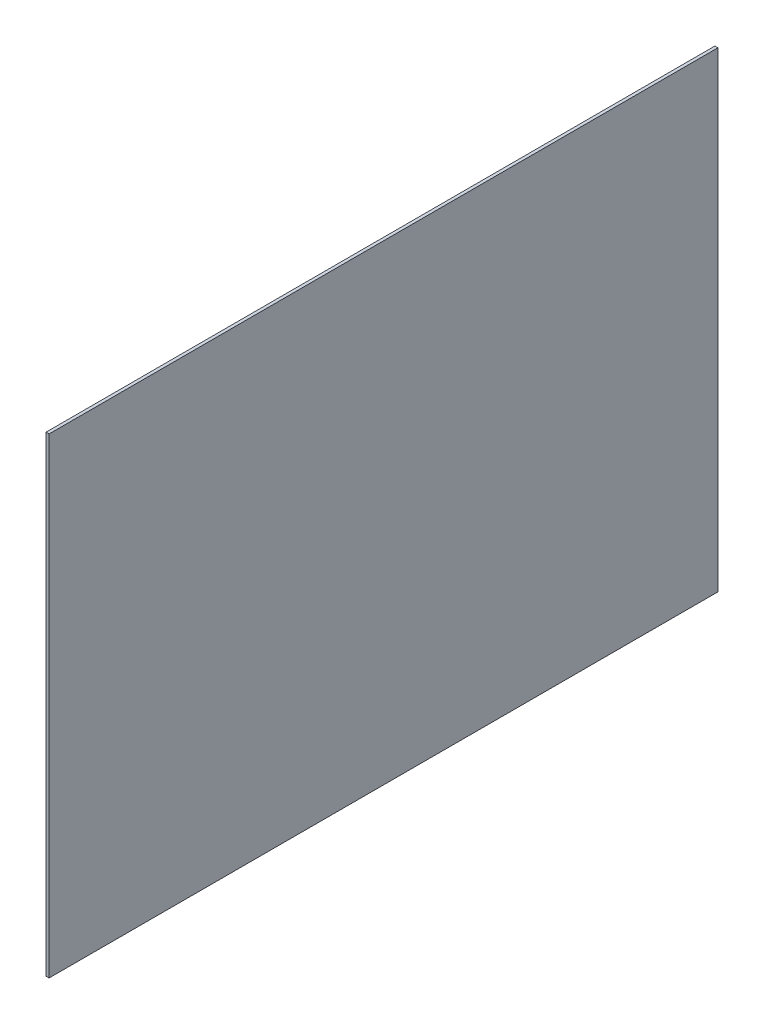
ISO-10303-21;
HEADER;
FILE_DESCRIPTION(('STEP AP214'),'2;1');
FILE_NAME('part.step','',(''),(''),'','','');
FILE_SCHEMA(('AUTOMOTIVE_DESIGN { 1 0 10303 214 1 1 1 1 }'));
ENDSEC;
DATA;
#1=APPLICATION_CONTEXT('core data for automotive mechanical design processes');
#2=APPLICATION_PROTOCOL_DEFINITION('international standard','automotive_design',2000,#1);
#3=PRODUCT_CONTEXT('',#1,'mechanical');
#4=PRODUCT('Part','Part','',(#3));
#5=PRODUCT_RELATED_PRODUCT_CATEGORY('part','',(#4));
#6=PRODUCT_DEFINITION_FORMATION('','',#4);
#7=PRODUCT_DEFINITION_CONTEXT('part definition',#1,'design');
#8=PRODUCT_DEFINITION('design','',#6,#7);
#9=PRODUCT_DEFINITION_SHAPE('','',#8);
#10=(LENGTH_UNIT() NAMED_UNIT(*) SI_UNIT(.MILLI.,.METRE.));
#11=(NAMED_UNIT(*) PLANE_ANGLE_UNIT() SI_UNIT($,.RADIAN.));
#12=(NAMED_UNIT(*) SI_UNIT($,.STERADIAN.) SOLID_ANGLE_UNIT());
#13=UNCERTAINTY_MEASURE_WITH_UNIT(LENGTH_MEASURE(1.E-05),#10,'distance_accuracy_value','');
#14=(GEOMETRIC_REPRESENTATION_CONTEXT(3) GLOBAL_UNCERTAINTY_ASSIGNED_CONTEXT((#13)) GLOBAL_UNIT_ASSIGNED_CONTEXT((#10,
#11,#12)) REPRESENTATION_CONTEXT('',''));
#15=CARTESIAN_POINT('',(0.,0.,0.));
#16=DIRECTION('',(0.,0.,1.));
#17=DIRECTION('',(1.,0.,0.));
#18=AXIS2_PLACEMENT_3D('',#15,#16,#17);
#19=CARTESIAN_POINT('',(2.,-155.,-220.));
#20=DIRECTION('',(0.,0.,1.));
#21=DIRECTION('',(0.,-1.,0.));
#22=AXIS2_PLACEMENT_3D('',#19,#20,#21);
#23=PLANE('',#22);
#24=DIRECTION('',(0.,1.,0.));
#25=VECTOR('',#24,1.);
#26=CARTESIAN_POINT('',(0.,-155.,-220.));
#27=LINE('',#26,#25);
#28=CARTESIAN_POINT('',(0.,-155.,-220.));
#29=VERTEX_POINT('',#28);
#30=CARTESIAN_POINT('',(0.,155.,-220.));
#31=VERTEX_POINT('',#30);
#32=EDGE_CURVE('E107',#29,#31,#27,.T.);
#33=ORIENTED_EDGE('',*,*,#32,.T.);
#34=DIRECTION('',(-1.,0.,0.));
#35=VECTOR('',#34,1.);
#36=CARTESIAN_POINT('',(2.,155.,-220.));
#37=LINE('',#36,#35);
#38=CARTESIAN_POINT('',(2.,155.,-220.));
#39=VERTEX_POINT('',#38);
#40=EDGE_CURVE('E11',#39,#31,#37,.T.);
#41=ORIENTED_EDGE('',*,*,#40,.F.);
#42=DIRECTION('',(0.,1.,0.));
#43=VECTOR('',#42,1.);
#44=CARTESIAN_POINT('',(2.,-155.,-220.));
#45=LINE('',#44,#43);
#46=CARTESIAN_POINT('',(2.,-155.,-220.));
#47=VERTEX_POINT('',#46);
#48=EDGE_CURVE('E91',#47,#39,#45,.T.);
#49=ORIENTED_EDGE('',*,*,#48,.F.);
#50=DIRECTION('',(-1.,0.,0.));
#51=VECTOR('',#50,1.);
#52=CARTESIAN_POINT('',(2.,-155.,-220.));
#53=LINE('',#52,#51);
#54=EDGE_CURVE('E103',#47,#29,#53,.T.);
#55=ORIENTED_EDGE('',*,*,#54,.T.);
#56=EDGE_LOOP('',(#33,#41,#49,#55));
#57=FACE_BOUND('',#56,.T.);
#58=ADVANCED_FACE('F39',(#57),#23,.F.);
#59=CARTESIAN_POINT('',(2.,155.,-220.));
#60=DIRECTION('',(0.,-1.,0.));
#61=DIRECTION('',(0.,0.,-1.));
#62=AXIS2_PLACEMENT_3D('',#59,#60,#61);
#63=PLANE('',#62);
#64=DIRECTION('',(0.,0.,1.));
#65=VECTOR('',#64,1.);
#66=CARTESIAN_POINT('',(0.,155.,-220.));
#67=LINE('',#66,#65);
#68=CARTESIAN_POINT('',(0.,155.,220.));
#69=VERTEX_POINT('',#68);
#70=EDGE_CURVE('E96',#31,#69,#67,.T.);
#71=ORIENTED_EDGE('',*,*,#70,.T.);
#72=DIRECTION('',(-1.,0.,0.));
#73=VECTOR('',#72,1.);
#74=CARTESIAN_POINT('',(2.,155.,220.));
#75=LINE('',#74,#73);
#76=CARTESIAN_POINT('',(2.,155.,220.));
#77=VERTEX_POINT('',#76);
#78=EDGE_CURVE('E48',#77,#69,#75,.T.);
#79=ORIENTED_EDGE('',*,*,#78,.F.);
#80=DIRECTION('',(0.,0.,1.));
#81=VECTOR('',#80,1.);
#82=CARTESIAN_POINT('',(2.,155.,-220.));
#83=LINE('',#82,#81);
#84=EDGE_CURVE('E86',#39,#77,#83,.T.);
#85=ORIENTED_EDGE('',*,*,#84,.F.);
#86=ORIENTED_EDGE('',*,*,#40,.T.);
#87=EDGE_LOOP('',(#71,#79,#85,#86));
#88=FACE_BOUND('',#87,.T.);
#89=ADVANCED_FACE('F95',(#88),#63,.F.);
#90=CARTESIAN_POINT('',(2.,155.,220.));
#91=DIRECTION('',(0.,0.,-1.));
#92=DIRECTION('',(-1.,0.,0.));
#93=AXIS2_PLACEMENT_3D('',#90,#91,#92);
#94=PLANE('',#93);
#95=DIRECTION('',(0.,-1.,0.));
#96=VECTOR('',#95,1.);
#97=CARTESIAN_POINT('',(0.,155.,220.));
#98=LINE('',#97,#96);
#99=CARTESIAN_POINT('',(0.,-155.,220.));
#100=VERTEX_POINT('',#99);
#101=EDGE_CURVE('E73',#69,#100,#98,.T.);
#102=ORIENTED_EDGE('',*,*,#101,.T.);
#103=DIRECTION('',(-1.,0.,0.));
#104=VECTOR('',#103,1.);
#105=CARTESIAN_POINT('',(2.,-155.,220.));
#106=LINE('',#105,#104);
#107=CARTESIAN_POINT('',(2.,-155.,220.));
#108=VERTEX_POINT('',#107);
#109=EDGE_CURVE('E98',#108,#100,#106,.T.);
#110=ORIENTED_EDGE('',*,*,#109,.F.);
#111=DIRECTION('',(0.,-1.,0.));
#112=VECTOR('',#111,1.);
#113=CARTESIAN_POINT('',(2.,155.,220.));
#114=LINE('',#113,#112);
#115=EDGE_CURVE('E89',#77,#108,#114,.T.);
#116=ORIENTED_EDGE('',*,*,#115,.F.);
#117=ORIENTED_EDGE('',*,*,#78,.T.);
#118=EDGE_LOOP('',(#102,#110,#116,#117));
#119=FACE_BOUND('',#118,.T.);
#120=ADVANCED_FACE('F99',(#119),#94,.F.);
#121=CARTESIAN_POINT('',(2.,-155.,220.));
#122=DIRECTION('',(0.,1.,0.));
#123=DIRECTION('',(0.,0.,1.));
#124=AXIS2_PLACEMENT_3D('',#121,#122,#123);
#125=PLANE('',#124);
#126=DIRECTION('',(0.,0.,-1.));
#127=VECTOR('',#126,1.);
#128=CARTESIAN_POINT('',(0.,-155.,220.));
#129=LINE('',#128,#127);
#130=EDGE_CURVE('E79',#100,#29,#129,.T.);
#131=ORIENTED_EDGE('',*,*,#130,.T.);
#132=ORIENTED_EDGE('',*,*,#54,.F.);
#133=DIRECTION('',(0.,0.,-1.));
#134=VECTOR('',#133,1.);
#135=CARTESIAN_POINT('',(2.,-155.,220.));
#136=LINE('',#135,#134);
#137=EDGE_CURVE('E56',#108,#47,#136,.T.);
#138=ORIENTED_EDGE('',*,*,#137,.F.);
#139=ORIENTED_EDGE('',*,*,#109,.T.);
#140=EDGE_LOOP('',(#131,#132,#138,#139));
#141=FACE_BOUND('',#140,.T.);
#142=ADVANCED_FACE('F120',(#141),#125,.F.);
#143=CARTESIAN_POINT('',(2.,0.,0.));
#144=DIRECTION('',(1.,0.,0.));
#145=DIRECTION('',(0.,0.,-1.));
#146=AXIS2_PLACEMENT_3D('',#143,#144,#145);
#147=PLANE('',#146);
#148=ORIENTED_EDGE('',*,*,#48,.T.);
#149=ORIENTED_EDGE('',*,*,#84,.T.);
#150=ORIENTED_EDGE('',*,*,#115,.T.);
#151=ORIENTED_EDGE('',*,*,#137,.T.);
#152=EDGE_LOOP('',(#148,#149,#150,#151));
#153=FACE_BOUND('',#152,.T.);
#154=ADVANCED_FACE('F87',(#153),#147,.T.);
#155=CARTESIAN_POINT('',(0.,0.,0.));
#156=DIRECTION('',(1.,0.,0.));
#157=DIRECTION('',(0.,0.,-1.));
#158=AXIS2_PLACEMENT_3D('',#155,#156,#157);
#159=PLANE('',#158);
#160=ORIENTED_EDGE('',*,*,#32,.F.);
#161=ORIENTED_EDGE('',*,*,#130,.F.);
#162=ORIENTED_EDGE('',*,*,#101,.F.);
#163=ORIENTED_EDGE('',*,*,#70,.F.);
#164=EDGE_LOOP('',(#160,#161,#162,#163));
#165=FACE_BOUND('',#164,.T.);
#166=ADVANCED_FACE('F123',(#165),#159,.F.);
#167=CLOSED_SHELL('',(#58,#89,#120,#142,#154,#166));
#168=MANIFOLD_SOLID_BREP('B2',#167);
#169=ADVANCED_BREP_SHAPE_REPRESENTATION('',(#18,#168),#14);
#170=SHAPE_DEFINITION_REPRESENTATION(#9,#169);
ENDSEC;
END-ISO-10303-21;
